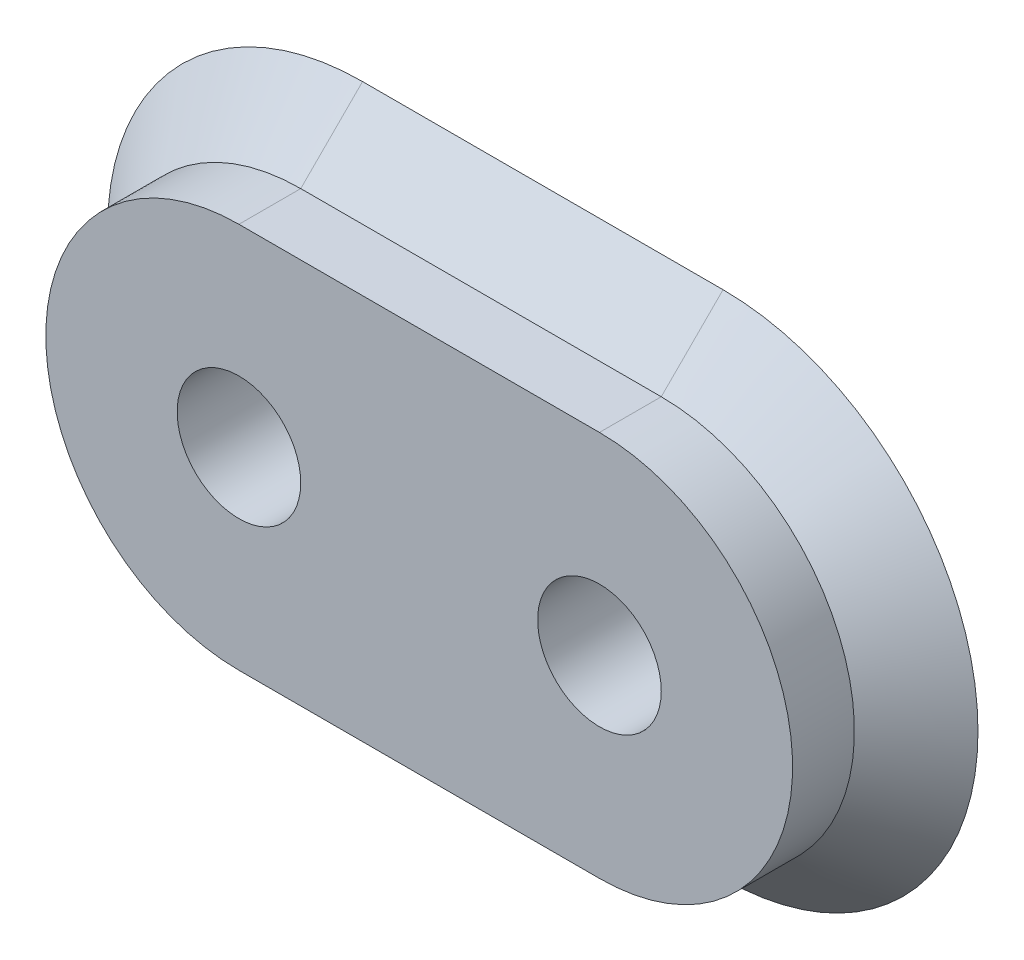
ISO-10303-21;
HEADER;
FILE_DESCRIPTION(('STEP AP214'),'2;1');
FILE_NAME('part.step','',(''),(''),'','','');
FILE_SCHEMA(('AUTOMOTIVE_DESIGN { 1 0 10303 214 1 1 1 1 }'));
ENDSEC;
DATA;
#1=APPLICATION_CONTEXT('core data for automotive mechanical design processes');
#2=APPLICATION_PROTOCOL_DEFINITION('international standard','automotive_design',2000,#1);
#3=PRODUCT_CONTEXT('',#1,'mechanical');
#4=PRODUCT('Part','Part','',(#3));
#5=PRODUCT_RELATED_PRODUCT_CATEGORY('part','',(#4));
#6=PRODUCT_DEFINITION_FORMATION('','',#4);
#7=PRODUCT_DEFINITION_CONTEXT('part definition',#1,'design');
#8=PRODUCT_DEFINITION('design','',#6,#7);
#9=PRODUCT_DEFINITION_SHAPE('','',#8);
#10=(LENGTH_UNIT() NAMED_UNIT(*) SI_UNIT(.MILLI.,.METRE.));
#11=(NAMED_UNIT(*) PLANE_ANGLE_UNIT() SI_UNIT($,.RADIAN.));
#12=(NAMED_UNIT(*) SI_UNIT($,.STERADIAN.) SOLID_ANGLE_UNIT());
#13=UNCERTAINTY_MEASURE_WITH_UNIT(LENGTH_MEASURE(1.E-05),#10,'distance_accuracy_value','');
#14=(GEOMETRIC_REPRESENTATION_CONTEXT(3) GLOBAL_UNCERTAINTY_ASSIGNED_CONTEXT((#13)) GLOBAL_UNIT_ASSIGNED_CONTEXT((#10,
#11,#12)) REPRESENTATION_CONTEXT('',''));
#15=CARTESIAN_POINT('',(0.,0.,0.));
#16=DIRECTION('',(0.,0.,1.));
#17=DIRECTION('',(1.,0.,0.));
#18=AXIS2_PLACEMENT_3D('',#15,#16,#17);
#19=CARTESIAN_POINT('',(0.,0.,12.));
#20=DIRECTION('',(0.,0.,-1.));
#21=DIRECTION('',(-1.,0.,0.));
#22=AXIS2_PLACEMENT_3D('',#19,#20,#21);
#23=CYLINDRICAL_SURFACE('',#22,37.5);
#24=CARTESIAN_POINT('',(0.,0.,0.));
#25=DIRECTION('',(0.,0.,1.));
#26=DIRECTION('',(1.,0.,0.));
#27=AXIS2_PLACEMENT_3D('',#24,#25,#26);
#28=CIRCLE('',#27,37.5);
#29=CARTESIAN_POINT('',(0.,37.5,0.));
#30=VERTEX_POINT('',#29);
#31=CARTESIAN_POINT('',(0.,-37.5,0.));
#32=VERTEX_POINT('',#31);
#33=EDGE_CURVE('E99',#30,#32,#28,.T.);
#34=ORIENTED_EDGE('',*,*,#33,.T.);
#35=DIRECTION('',(0.,0.,-1.));
#36=VECTOR('',#35,1.);
#37=CARTESIAN_POINT('',(0.,-37.5,12.));
#38=LINE('',#37,#36);
#39=CARTESIAN_POINT('',(0.,-37.5,12.));
#40=VERTEX_POINT('',#39);
#41=EDGE_CURVE('E11',#40,#32,#38,.T.);
#42=ORIENTED_EDGE('',*,*,#41,.F.);
#43=CARTESIAN_POINT('',(0.,0.,12.));
#44=DIRECTION('',(0.,0.,1.));
#45=DIRECTION('',(1.,0.,0.));
#46=AXIS2_PLACEMENT_3D('',#43,#44,#45);
#47=CIRCLE('',#46,37.5);
#48=CARTESIAN_POINT('',(0.,37.5,12.));
#49=VERTEX_POINT('',#48);
#50=EDGE_CURVE('E115',#49,#40,#47,.T.);
#51=ORIENTED_EDGE('',*,*,#50,.F.);
#52=DIRECTION('',(0.,0.,-1.));
#53=VECTOR('',#52,1.);
#54=CARTESIAN_POINT('',(0.,37.5,12.));
#55=LINE('',#54,#53);
#56=EDGE_CURVE('E123',#49,#30,#55,.T.);
#57=ORIENTED_EDGE('',*,*,#56,.T.);
#58=EDGE_LOOP('',(#34,#42,#51,#57));
#59=FACE_BOUND('',#58,.T.);
#60=ADVANCED_FACE('F34',(#59),#23,.T.);
#61=CARTESIAN_POINT('',(0.,-37.5,12.));
#62=DIRECTION('',(0.,1.,0.));
#63=DIRECTION('',(0.,0.,1.));
#64=AXIS2_PLACEMENT_3D('',#61,#62,#63);
#65=PLANE('',#64);
#66=DIRECTION('',(1.,0.,0.));
#67=VECTOR('',#66,1.);
#68=CARTESIAN_POINT('',(0.,-37.5,0.));
#69=LINE('',#68,#67);
#70=CARTESIAN_POINT('',(70.,-37.5,0.));
#71=VERTEX_POINT('',#70);
#72=EDGE_CURVE('E125',#32,#71,#69,.T.);
#73=ORIENTED_EDGE('',*,*,#72,.T.);
#74=DIRECTION('',(0.,0.,-1.));
#75=VECTOR('',#74,1.);
#76=CARTESIAN_POINT('',(70.,-37.5,12.));
#77=LINE('',#76,#75);
#78=CARTESIAN_POINT('',(70.,-37.5,12.));
#79=VERTEX_POINT('',#78);
#80=EDGE_CURVE('E44',#79,#71,#77,.T.);
#81=ORIENTED_EDGE('',*,*,#80,.F.);
#82=DIRECTION('',(1.,0.,0.));
#83=VECTOR('',#82,1.);
#84=CARTESIAN_POINT('',(0.,-37.5,12.));
#85=LINE('',#84,#83);
#86=EDGE_CURVE('E117',#40,#79,#85,.T.);
#87=ORIENTED_EDGE('',*,*,#86,.F.);
#88=ORIENTED_EDGE('',*,*,#41,.T.);
#89=EDGE_LOOP('',(#73,#81,#87,#88));
#90=FACE_BOUND('',#89,.T.);
#91=ADVANCED_FACE('F147',(#90),#65,.F.);
#92=CARTESIAN_POINT('',(70.,0.,12.));
#93=DIRECTION('',(0.,0.,-1.));
#94=DIRECTION('',(-1.,0.,0.));
#95=AXIS2_PLACEMENT_3D('',#92,#93,#94);
#96=CYLINDRICAL_SURFACE('',#95,37.5);
#97=CARTESIAN_POINT('',(70.,0.,0.));
#98=DIRECTION('',(0.,0.,1.));
#99=DIRECTION('',(1.,0.,0.));
#100=AXIS2_PLACEMENT_3D('',#97,#98,#99);
#101=CIRCLE('',#100,37.5);
#102=CARTESIAN_POINT('',(70.,37.5,0.));
#103=VERTEX_POINT('',#102);
#104=EDGE_CURVE('E128',#71,#103,#101,.T.);
#105=ORIENTED_EDGE('',*,*,#104,.T.);
#106=DIRECTION('',(0.,0.,-1.));
#107=VECTOR('',#106,1.);
#108=CARTESIAN_POINT('',(70.,37.5,12.));
#109=LINE('',#108,#107);
#110=CARTESIAN_POINT('',(70.,37.5,12.));
#111=VERTEX_POINT('',#110);
#112=EDGE_CURVE('E133',#111,#103,#109,.T.);
#113=ORIENTED_EDGE('',*,*,#112,.F.);
#114=CARTESIAN_POINT('',(70.,0.,12.));
#115=DIRECTION('',(0.,0.,1.));
#116=DIRECTION('',(1.,0.,0.));
#117=AXIS2_PLACEMENT_3D('',#114,#115,#116);
#118=CIRCLE('',#117,37.5);
#119=EDGE_CURVE('E120',#79,#111,#118,.T.);
#120=ORIENTED_EDGE('',*,*,#119,.F.);
#121=ORIENTED_EDGE('',*,*,#80,.T.);
#122=EDGE_LOOP('',(#105,#113,#120,#121));
#123=FACE_BOUND('',#122,.T.);
#124=ADVANCED_FACE('F151',(#123),#96,.T.);
#125=CARTESIAN_POINT('',(0.,37.5,12.));
#126=DIRECTION('',(0.,-1.,0.));
#127=DIRECTION('',(0.,0.,-1.));
#128=AXIS2_PLACEMENT_3D('',#125,#126,#127);
#129=PLANE('',#128);
#130=DIRECTION('',(-1.,0.,0.));
#131=VECTOR('',#130,1.);
#132=CARTESIAN_POINT('',(0.,37.5,0.));
#133=LINE('',#132,#131);
#134=EDGE_CURVE('E118',#103,#30,#133,.T.);
#135=ORIENTED_EDGE('',*,*,#134,.T.);
#136=ORIENTED_EDGE('',*,*,#56,.F.);
#137=DIRECTION('',(-1.,0.,0.));
#138=VECTOR('',#137,1.);
#139=CARTESIAN_POINT('',(0.,37.5,12.));
#140=LINE('',#139,#138);
#141=EDGE_CURVE('E52',#111,#49,#140,.T.);
#142=ORIENTED_EDGE('',*,*,#141,.F.);
#143=ORIENTED_EDGE('',*,*,#112,.T.);
#144=EDGE_LOOP('',(#135,#136,#142,#143));
#145=FACE_BOUND('',#144,.T.);
#146=ADVANCED_FACE('F157',(#145),#129,.F.);
#147=CARTESIAN_POINT('',(0.,0.,12.));
#148=DIRECTION('',(0.,0.,1.));
#149=DIRECTION('',(1.,0.,0.));
#150=AXIS2_PLACEMENT_3D('',#147,#148,#149);
#151=PLANE('',#150);
#152=CARTESIAN_POINT('',(0.,0.,12.));
#153=DIRECTION('',(0.,0.,1.));
#154=DIRECTION('',(1.,0.,0.));
#155=AXIS2_PLACEMENT_3D('',#152,#153,#154);
#156=CIRCLE('',#155,12.);
#157=CARTESIAN_POINT('',(12.,0.,12.));
#158=VERTEX_POINT('',#157);
#159=EDGE_CURVE('E197',#158,#158,#156,.T.);
#160=ORIENTED_EDGE('',*,*,#159,.F.);
#161=EDGE_LOOP('',(#160));
#162=FACE_BOUND('',#161,.T.);
#163=CARTESIAN_POINT('',(70.,0.,12.));
#164=DIRECTION('',(0.,0.,1.));
#165=DIRECTION('',(1.,0.,0.));
#166=AXIS2_PLACEMENT_3D('',#163,#164,#165);
#167=CIRCLE('',#166,12.);
#168=CARTESIAN_POINT('',(82.,0.,12.));
#169=VERTEX_POINT('',#168);
#170=EDGE_CURVE('E202',#169,#169,#167,.T.);
#171=ORIENTED_EDGE('',*,*,#170,.F.);
#172=EDGE_LOOP('',(#171));
#173=FACE_BOUND('',#172,.T.);
#174=ORIENTED_EDGE('',*,*,#50,.T.);
#175=ORIENTED_EDGE('',*,*,#86,.T.);
#176=ORIENTED_EDGE('',*,*,#119,.T.);
#177=ORIENTED_EDGE('',*,*,#141,.T.);
#178=EDGE_LOOP('',(#174,#175,#176,#177));
#179=FACE_BOUND('',#178,.T.);
#180=ADVANCED_FACE('F153',(#162,#173,#179),#151,.T.);
#181=CARTESIAN_POINT('',(0.,0.,-12.));
#182=DIRECTION('',(0.,0.,-1.));
#183=DIRECTION('',(-1.,0.,0.));
#184=AXIS2_PLACEMENT_3D('',#181,#182,#183);
#185=PLANE('',#184);
#186=CARTESIAN_POINT('',(0.,0.,-12.));
#187=DIRECTION('',(0.,0.,1.));
#188=DIRECTION('',(1.,0.,0.));
#189=AXIS2_PLACEMENT_3D('',#186,#187,#188);
#190=CIRCLE('',#189,12.);
#191=CARTESIAN_POINT('',(12.,0.,-12.));
#192=VERTEX_POINT('',#191);
#193=EDGE_CURVE('E138',#192,#192,#190,.T.);
#194=ORIENTED_EDGE('',*,*,#193,.T.);
#195=EDGE_LOOP('',(#194));
#196=FACE_BOUND('',#195,.T.);
#197=CARTESIAN_POINT('',(70.,0.,-12.));
#198=DIRECTION('',(0.,0.,1.));
#199=DIRECTION('',(1.,0.,0.));
#200=AXIS2_PLACEMENT_3D('',#197,#198,#199);
#201=CIRCLE('',#200,12.);
#202=CARTESIAN_POINT('',(82.,0.,-12.));
#203=VERTEX_POINT('',#202);
#204=EDGE_CURVE('E198',#203,#203,#201,.T.);
#205=ORIENTED_EDGE('',*,*,#204,.T.);
#206=EDGE_LOOP('',(#205));
#207=FACE_BOUND('',#206,.T.);
#208=CARTESIAN_POINT('',(0.,0.,-12.));
#209=DIRECTION('',(0.,0.,-1.));
#210=DIRECTION('',(-1.,0.,0.));
#211=AXIS2_PLACEMENT_3D('',#208,#209,#210);
#212=CIRCLE('',#211,49.5);
#213=CARTESIAN_POINT('',(0.,-49.5,-12.));
#214=VERTEX_POINT('',#213);
#215=CARTESIAN_POINT('',(0.,49.5,-12.));
#216=VERTEX_POINT('',#215);
#217=EDGE_CURVE('E84',#214,#216,#212,.T.);
#218=ORIENTED_EDGE('',*,*,#217,.T.);
#219=DIRECTION('',(1.,0.,0.));
#220=VECTOR('',#219,1.);
#221=CARTESIAN_POINT('',(0.,49.5,-12.));
#222=LINE('',#221,#220);
#223=CARTESIAN_POINT('',(70.,49.5,-12.));
#224=VERTEX_POINT('',#223);
#225=EDGE_CURVE('E88',#216,#224,#222,.T.);
#226=ORIENTED_EDGE('',*,*,#225,.T.);
#227=CARTESIAN_POINT('',(70.,0.,-12.));
#228=DIRECTION('',(0.,0.,-1.));
#229=DIRECTION('',(-1.,0.,0.));
#230=AXIS2_PLACEMENT_3D('',#227,#228,#229);
#231=CIRCLE('',#230,49.5);
#232=CARTESIAN_POINT('',(70.,-49.5,-12.));
#233=VERTEX_POINT('',#232);
#234=EDGE_CURVE('E109',#224,#233,#231,.T.);
#235=ORIENTED_EDGE('',*,*,#234,.T.);
#236=DIRECTION('',(-1.,0.,0.));
#237=VECTOR('',#236,1.);
#238=CARTESIAN_POINT('',(0.,-49.5,-12.));
#239=LINE('',#238,#237);
#240=EDGE_CURVE('E90',#233,#214,#239,.T.);
#241=ORIENTED_EDGE('',*,*,#240,.T.);
#242=EDGE_LOOP('',(#218,#226,#235,#241));
#243=FACE_BOUND('',#242,.T.);
#244=ADVANCED_FACE('F86',(#196,#207,#243),#185,.T.);
#245=CARTESIAN_POINT('',(0.,-49.5,-12.));
#246=DIRECTION('',(0.,0.707106781186547,-0.707106781186548));
#247=DIRECTION('',(-1.,0.,0.));
#248=AXIS2_PLACEMENT_3D('',#245,#246,#247);
#249=PLANE('',#248);
#250=DIRECTION('',(0.,-0.707106781186548,-0.707106781186547));
#251=VECTOR('',#250,1.);
#252=CARTESIAN_POINT('',(70.,-37.5,0.));
#253=LINE('',#252,#251);
#254=EDGE_CURVE('E103',#71,#233,#253,.T.);
#255=ORIENTED_EDGE('',*,*,#254,.F.);
#256=ORIENTED_EDGE('',*,*,#72,.F.);
#257=DIRECTION('',(0.,0.707106781186548,0.707106781186547));
#258=VECTOR('',#257,1.);
#259=CARTESIAN_POINT('',(0.,-49.5,-12.));
#260=LINE('',#259,#258);
#261=EDGE_CURVE('E38',#214,#32,#260,.T.);
#262=ORIENTED_EDGE('',*,*,#261,.F.);
#263=ORIENTED_EDGE('',*,*,#240,.F.);
#264=EDGE_LOOP('',(#255,#256,#262,#263));
#265=FACE_BOUND('',#264,.T.);
#266=ADVANCED_FACE('F36',(#265),#249,.F.);
#267=CARTESIAN_POINT('',(0.,0.,-12.));
#268=DIRECTION('',(0.,0.,-1.));
#269=DIRECTION('',(-1.,0.,0.));
#270=AXIS2_PLACEMENT_3D('',#267,#268,#269);
#271=CONICAL_SURFACE('',#270,49.5,0.785398163397449);
#272=ORIENTED_EDGE('',*,*,#261,.T.);
#273=ORIENTED_EDGE('',*,*,#33,.F.);
#274=DIRECTION('',(0.,-0.707106781186548,0.707106781186547));
#275=VECTOR('',#274,1.);
#276=CARTESIAN_POINT('',(0.,49.5,-12.));
#277=LINE('',#276,#275);
#278=EDGE_CURVE('E96',#216,#30,#277,.T.);
#279=ORIENTED_EDGE('',*,*,#278,.F.);
#280=ORIENTED_EDGE('',*,*,#217,.F.);
#281=EDGE_LOOP('',(#272,#273,#279,#280));
#282=FACE_BOUND('',#281,.T.);
#283=ADVANCED_FACE('F97',(#282),#271,.T.);
#284=CARTESIAN_POINT('',(70.,0.,-12.));
#285=DIRECTION('',(0.,0.,-1.));
#286=DIRECTION('',(-1.,0.,0.));
#287=AXIS2_PLACEMENT_3D('',#284,#285,#286);
#288=CONICAL_SURFACE('',#287,49.5,0.785398163397449);
#289=ORIENTED_EDGE('',*,*,#254,.T.);
#290=ORIENTED_EDGE('',*,*,#234,.F.);
#291=DIRECTION('',(0.,0.707106781186548,-0.707106781186547));
#292=VECTOR('',#291,1.);
#293=CARTESIAN_POINT('',(70.,37.5,0.));
#294=LINE('',#293,#292);
#295=EDGE_CURVE('E104',#103,#224,#294,.T.);
#296=ORIENTED_EDGE('',*,*,#295,.F.);
#297=ORIENTED_EDGE('',*,*,#104,.F.);
#298=EDGE_LOOP('',(#289,#290,#296,#297));
#299=FACE_BOUND('',#298,.T.);
#300=ADVANCED_FACE('F158',(#299),#288,.T.);
#301=CARTESIAN_POINT('',(0.,49.5,-12.));
#302=DIRECTION('',(0.,-0.707106781186547,-0.707106781186548));
#303=DIRECTION('',(1.,0.,0.));
#304=AXIS2_PLACEMENT_3D('',#301,#302,#303);
#305=PLANE('',#304);
#306=ORIENTED_EDGE('',*,*,#278,.T.);
#307=ORIENTED_EDGE('',*,*,#134,.F.);
#308=ORIENTED_EDGE('',*,*,#295,.T.);
#309=ORIENTED_EDGE('',*,*,#225,.F.);
#310=EDGE_LOOP('',(#306,#307,#308,#309));
#311=FACE_BOUND('',#310,.T.);
#312=ADVANCED_FACE('F106',(#311),#305,.F.);
#313=CARTESIAN_POINT('',(70.,0.,-12.));
#314=DIRECTION('',(0.,0.,1.));
#315=DIRECTION('',(1.,0.,0.));
#316=AXIS2_PLACEMENT_3D('',#313,#314,#315);
#317=CYLINDRICAL_SURFACE('',#316,12.);
#318=ORIENTED_EDGE('',*,*,#204,.F.);
#319=EDGE_LOOP('',(#318));
#320=FACE_BOUND('',#319,.T.);
#321=ORIENTED_EDGE('',*,*,#170,.T.);
#322=EDGE_LOOP('',(#321));
#323=FACE_BOUND('',#322,.T.);
#324=ADVANCED_FACE('F165',(#320,#323),#317,.F.);
#325=CARTESIAN_POINT('',(0.,0.,-12.));
#326=DIRECTION('',(0.,0.,1.));
#327=DIRECTION('',(1.,0.,0.));
#328=AXIS2_PLACEMENT_3D('',#325,#326,#327);
#329=CYLINDRICAL_SURFACE('',#328,12.);
#330=ORIENTED_EDGE('',*,*,#193,.F.);
#331=EDGE_LOOP('',(#330));
#332=FACE_BOUND('',#331,.T.);
#333=ORIENTED_EDGE('',*,*,#159,.T.);
#334=EDGE_LOOP('',(#333));
#335=FACE_BOUND('',#334,.T.);
#336=ADVANCED_FACE('F186',(#332,#335),#329,.F.);
#337=CLOSED_SHELL('',(#60,#91,#124,#146,#180,#244,#266,#283,#300,#312,#324,#336));
#338=MANIFOLD_SOLID_BREP('B2',#337);
#339=ADVANCED_BREP_SHAPE_REPRESENTATION('',(#18,#338),#14);
#340=SHAPE_DEFINITION_REPRESENTATION(#9,#339);
ENDSEC;
END-ISO-10303-21;
